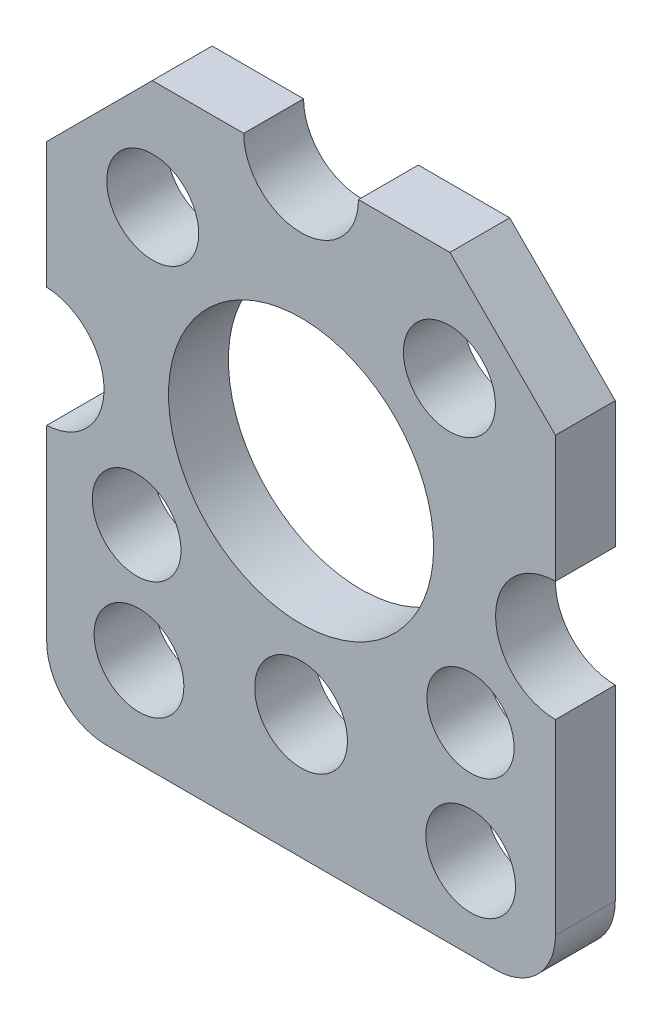
ISO-10303-21;
HEADER;
FILE_DESCRIPTION(('STEP AP214'),'2;1');
FILE_NAME('part.step','',(''),(''),'','','');
FILE_SCHEMA(('AUTOMOTIVE_DESIGN { 1 0 10303 214 1 1 1 1 }'));
ENDSEC;
DATA;
#1=APPLICATION_CONTEXT('core data for automotive mechanical design processes');
#2=APPLICATION_PROTOCOL_DEFINITION('international standard','automotive_design',2000,#1);
#3=PRODUCT_CONTEXT('',#1,'mechanical');
#4=PRODUCT('Part','Part','',(#3));
#5=PRODUCT_RELATED_PRODUCT_CATEGORY('part','',(#4));
#6=PRODUCT_DEFINITION_FORMATION('','',#4);
#7=PRODUCT_DEFINITION_CONTEXT('part definition',#1,'design');
#8=PRODUCT_DEFINITION('design','',#6,#7);
#9=PRODUCT_DEFINITION_SHAPE('','',#8);
#10=(LENGTH_UNIT() NAMED_UNIT(*) SI_UNIT(.MILLI.,.METRE.));
#11=(NAMED_UNIT(*) PLANE_ANGLE_UNIT() SI_UNIT($,.RADIAN.));
#12=(NAMED_UNIT(*) SI_UNIT($,.STERADIAN.) SOLID_ANGLE_UNIT());
#13=UNCERTAINTY_MEASURE_WITH_UNIT(LENGTH_MEASURE(1.E-05),#10,'distance_accuracy_value','');
#14=(GEOMETRIC_REPRESENTATION_CONTEXT(3) GLOBAL_UNCERTAINTY_ASSIGNED_CONTEXT((#13)) GLOBAL_UNIT_ASSIGNED_CONTEXT((#10,
#11,#12)) REPRESENTATION_CONTEXT('',''));
#15=CARTESIAN_POINT('',(0.,0.,0.));
#16=DIRECTION('',(0.,0.,1.));
#17=DIRECTION('',(1.,0.,0.));
#18=AXIS2_PLACEMENT_3D('',#15,#16,#17);
#19=CARTESIAN_POINT('',(-1.60380436077684,17.4149915302089,2.54));
#20=DIRECTION('',(1.,0.,0.));
#21=DIRECTION('',(0.,1.,0.));
#22=AXIS2_PLACEMENT_3D('',#19,#20,#21);
#23=PLANE('',#22);
#24=DIRECTION('',(0.,0.,1.));
#25=VECTOR('',#24,1.);
#26=CARTESIAN_POINT('',(-1.60380436077684,7.56433360169332,0.));
#27=LINE('',#26,#25);
#28=CARTESIAN_POINT('',(-1.60380436077684,7.56433360169332,0.));
#29=VERTEX_POINT('',#28);
#30=CARTESIAN_POINT('',(-1.60380436077684,7.56433360169332,2.54));
#31=VERTEX_POINT('',#30);
#32=EDGE_CURVE('E237',#29,#31,#27,.T.);
#33=ORIENTED_EDGE('',*,*,#32,.F.);
#34=DIRECTION('',(0.,-1.,0.));
#35=VECTOR('',#34,1.);
#36=CARTESIAN_POINT('',(-1.60380436077684,17.4149915302089,0.));
#37=LINE('',#36,#35);
#38=CARTESIAN_POINT('',(-1.60380436077684,12.9344399546406,0.));
#39=VERTEX_POINT('',#38);
#40=EDGE_CURVE('E172',#39,#29,#37,.T.);
#41=ORIENTED_EDGE('',*,*,#40,.F.);
#42=DIRECTION('',(0.,0.,-1.));
#43=VECTOR('',#42,1.);
#44=CARTESIAN_POINT('',(-1.60380436077684,12.9344399546405,2.54));
#45=LINE('',#44,#43);
#46=CARTESIAN_POINT('',(-1.60380436077684,12.9344399546405,2.54));
#47=VERTEX_POINT('',#46);
#48=EDGE_CURVE('E225',#47,#39,#45,.T.);
#49=ORIENTED_EDGE('',*,*,#48,.F.);
#50=DIRECTION('',(0.,-1.,0.));
#51=VECTOR('',#50,1.);
#52=CARTESIAN_POINT('',(-1.60380436077684,17.4149915302089,2.54));
#53=LINE('',#52,#51);
#54=EDGE_CURVE('E264',#47,#31,#53,.T.);
#55=ORIENTED_EDGE('',*,*,#54,.T.);
#56=EDGE_LOOP('',(#33,#41,#49,#55));
#57=FACE_BOUND('',#56,.T.);
#58=ADVANCED_FACE('F39',(#57),#23,.T.);
#59=CARTESIAN_POINT('',(-23.1938043607768,17.4149915302089,2.54));
#60=DIRECTION('',(0.,1.,0.));
#61=DIRECTION('',(0.,0.,1.));
#62=AXIS2_PLACEMENT_3D('',#59,#60,#61);
#63=PLANE('',#62);
#64=DIRECTION('',(0.,0.,1.));
#65=VECTOR('',#64,1.);
#66=CARTESIAN_POINT('',(-14.833145749413,17.4149915302089,0.));
#67=LINE('',#66,#65);
#68=CARTESIAN_POINT('',(-14.833145749413,17.4149915302089,0.));
#69=VERTEX_POINT('',#68);
#70=CARTESIAN_POINT('',(-14.833145749413,17.4149915302089,2.54));
#71=VERTEX_POINT('',#70);
#72=EDGE_CURVE('E141',#69,#71,#67,.T.);
#73=ORIENTED_EDGE('',*,*,#72,.F.);
#74=DIRECTION('',(1.,0.,0.));
#75=VECTOR('',#74,1.);
#76=CARTESIAN_POINT('',(-23.1938043607768,17.4149915302089,0.));
#77=LINE('',#76,#75);
#78=CARTESIAN_POINT('',(-18.7132527852085,17.4149915302089,0.));
#79=VERTEX_POINT('',#78);
#80=EDGE_CURVE('E155',#79,#69,#77,.T.);
#81=ORIENTED_EDGE('',*,*,#80,.F.);
#82=DIRECTION('',(0.,0.,-1.));
#83=VECTOR('',#82,1.);
#84=CARTESIAN_POINT('',(-18.7132527852085,17.4149915302089,2.54));
#85=LINE('',#84,#83);
#86=CARTESIAN_POINT('',(-18.7132527852085,17.4149915302089,2.54));
#87=VERTEX_POINT('',#86);
#88=EDGE_CURVE('E219',#87,#79,#85,.T.);
#89=ORIENTED_EDGE('',*,*,#88,.F.);
#90=DIRECTION('',(1.,0.,0.));
#91=VECTOR('',#90,1.);
#92=CARTESIAN_POINT('',(-23.1938043607768,17.4149915302089,2.54));
#93=LINE('',#92,#91);
#94=EDGE_CURVE('E157',#87,#71,#93,.T.);
#95=ORIENTED_EDGE('',*,*,#94,.T.);
#96=EDGE_LOOP('',(#73,#81,#89,#95));
#97=FACE_BOUND('',#96,.T.);
#98=ADVANCED_FACE('F153',(#97),#63,.T.);
#99=CARTESIAN_POINT('',(-23.1938043607768,17.4149915302089,2.54));
#100=DIRECTION('',(1.,0.,0.));
#101=DIRECTION('',(0.,1.,0.));
#102=AXIS2_PLACEMENT_3D('',#99,#100,#101);
#103=PLANE('',#102);
#104=DIRECTION('',(0.,-1.,0.));
#105=VECTOR('',#104,1.);
#106=CARTESIAN_POINT('',(-23.1938043607768,17.4149915302089,0.));
#107=LINE('',#106,#105);
#108=CARTESIAN_POINT('',(-23.1938043607768,12.9344399546405,0.));
#109=VERTEX_POINT('',#108);
#110=CARTESIAN_POINT('',(-23.1938043607768,7.57828265375295,0.));
#111=VERTEX_POINT('',#110);
#112=EDGE_CURVE('E170',#109,#111,#107,.T.);
#113=ORIENTED_EDGE('',*,*,#112,.T.);
#114=DIRECTION('',(0.,0.,1.));
#115=VECTOR('',#114,1.);
#116=CARTESIAN_POINT('',(-23.1938043607768,7.57828265375295,0.));
#117=LINE('',#116,#115);
#118=CARTESIAN_POINT('',(-23.1938043607768,7.57828265375295,2.54));
#119=VERTEX_POINT('',#118);
#120=EDGE_CURVE('E54',#111,#119,#117,.T.);
#121=ORIENTED_EDGE('',*,*,#120,.T.);
#122=DIRECTION('',(0.,-1.,0.));
#123=VECTOR('',#122,1.);
#124=CARTESIAN_POINT('',(-23.1938043607768,17.4149915302089,2.54));
#125=LINE('',#124,#123);
#126=CARTESIAN_POINT('',(-23.1938043607768,12.9344399546405,2.54));
#127=VERTEX_POINT('',#126);
#128=EDGE_CURVE('E184',#127,#119,#125,.T.);
#129=ORIENTED_EDGE('',*,*,#128,.F.);
#130=DIRECTION('',(0.,0.,-1.));
#131=VECTOR('',#130,1.);
#132=CARTESIAN_POINT('',(-23.1938043607768,12.9344399546405,2.54));
#133=LINE('',#132,#131);
#134=EDGE_CURVE('E217',#127,#109,#133,.T.);
#135=ORIENTED_EDGE('',*,*,#134,.T.);
#136=EDGE_LOOP('',(#113,#121,#129,#135));
#137=FACE_BOUND('',#136,.T.);
#138=ADVANCED_FACE('F222',(#137),#103,.F.);
#139=CARTESIAN_POINT('',(-23.1938043607768,-7.98500846979108,2.54));
#140=DIRECTION('',(0.,1.,0.));
#141=DIRECTION('',(0.,0.,1.));
#142=AXIS2_PLACEMENT_3D('',#139,#140,#141);
#143=PLANE('',#142);
#144=DIRECTION('',(1.,0.,0.));
#145=VECTOR('',#144,1.);
#146=CARTESIAN_POINT('',(-23.1938043607768,-7.98500846979108,0.));
#147=LINE('',#146,#145);
#148=CARTESIAN_POINT('',(-20.6538043607768,-7.98500846979108,0.));
#149=VERTEX_POINT('',#148);
#150=CARTESIAN_POINT('',(-4.14380436077684,-7.98500846979108,0.));
#151=VERTEX_POINT('',#150);
#152=EDGE_CURVE('E259',#149,#151,#147,.T.);
#153=ORIENTED_EDGE('',*,*,#152,.T.);
#154=DIRECTION('',(0.,0.,-1.));
#155=VECTOR('',#154,1.);
#156=CARTESIAN_POINT('',(-4.14380436077684,-7.98500846979108,2.54));
#157=LINE('',#156,#155);
#158=CARTESIAN_POINT('',(-4.14380436077684,-7.98500846979108,2.54));
#159=VERTEX_POINT('',#158);
#160=EDGE_CURVE('E195',#151,#159,#157,.F.);
#161=ORIENTED_EDGE('',*,*,#160,.T.);
#162=DIRECTION('',(1.,0.,0.));
#163=VECTOR('',#162,1.);
#164=CARTESIAN_POINT('',(-23.1938043607768,-7.98500846979108,2.54));
#165=LINE('',#164,#163);
#166=CARTESIAN_POINT('',(-20.6538043607768,-7.98500846979108,2.54));
#167=VERTEX_POINT('',#166);
#168=EDGE_CURVE('E178',#167,#159,#165,.T.);
#169=ORIENTED_EDGE('',*,*,#168,.F.);
#170=DIRECTION('',(0.,0.,-1.));
#171=VECTOR('',#170,1.);
#172=CARTESIAN_POINT('',(-20.6538043607768,-7.98500846979108,2.54));
#173=LINE('',#172,#171);
#174=EDGE_CURVE('E191',#167,#149,#173,.T.);
#175=ORIENTED_EDGE('',*,*,#174,.T.);
#176=EDGE_LOOP('',(#153,#161,#169,#175));
#177=FACE_BOUND('',#176,.T.);
#178=ADVANCED_FACE('F428',(#177),#143,.F.);
#179=DIRECTION('',(0.,0.,1.));
#180=VECTOR('',#179,1.);
#181=CARTESIAN_POINT('',(-1.60380436077684,2.48342628813906,0.));
#182=LINE('',#181,#180);
#183=CARTESIAN_POINT('',(-1.60380436077684,2.48342628813906,2.54));
#184=VERTEX_POINT('',#183);
#185=CARTESIAN_POINT('',(-1.60380436077684,2.48342628813906,0.));
#186=VERTEX_POINT('',#185);
#187=EDGE_CURVE('E62',#184,#186,#182,.F.);
#188=ORIENTED_EDGE('',*,*,#187,.F.);
#189=CARTESIAN_POINT('',(-1.60380436077684,-5.44500846979108,2.54));
#190=VERTEX_POINT('',#189);
#191=EDGE_CURVE('E263',#184,#190,#53,.T.);
#192=ORIENTED_EDGE('',*,*,#191,.T.);
#193=DIRECTION('',(0.,0.,-1.));
#194=VECTOR('',#193,1.);
#195=CARTESIAN_POINT('',(-1.60380436077684,-5.44500846979108,0.));
#196=LINE('',#195,#194);
#197=CARTESIAN_POINT('',(-1.60380436077684,-5.44500846979108,0.));
#198=VERTEX_POINT('',#197);
#199=EDGE_CURVE('E179',#190,#198,#196,.T.);
#200=ORIENTED_EDGE('',*,*,#199,.T.);
#201=EDGE_CURVE('E274',#186,#198,#37,.T.);
#202=ORIENTED_EDGE('',*,*,#201,.F.);
#203=EDGE_LOOP('',(#188,#192,#200,#202));
#204=FACE_BOUND('',#203,.T.);
#205=ADVANCED_FACE('F420',(#204),#23,.T.);
#206=DIRECTION('',(0.,0.,1.));
#207=VECTOR('',#206,1.);
#208=CARTESIAN_POINT('',(-9.96446297214064,17.4149915302089,0.));
#209=LINE('',#208,#207);
#210=CARTESIAN_POINT('',(-9.96446297214064,17.4149915302089,2.54));
#211=VERTEX_POINT('',#210);
#212=CARTESIAN_POINT('',(-9.96446297214064,17.4149915302089,0.));
#213=VERTEX_POINT('',#212);
#214=EDGE_CURVE('E144',#211,#213,#209,.F.);
#215=ORIENTED_EDGE('',*,*,#214,.F.);
#216=CARTESIAN_POINT('',(-6.08435593634521,17.4149915302089,2.54));
#217=VERTEX_POINT('',#216);
#218=EDGE_CURVE('E268',#211,#217,#93,.T.);
#219=ORIENTED_EDGE('',*,*,#218,.T.);
#220=DIRECTION('',(0.,0.,1.));
#221=VECTOR('',#220,1.);
#222=CARTESIAN_POINT('',(-6.08435593634521,17.4149915302089,2.54));
#223=LINE('',#222,#221);
#224=CARTESIAN_POINT('',(-6.08435593634521,17.4149915302089,0.));
#225=VERTEX_POINT('',#224);
#226=EDGE_CURVE('E249',#225,#217,#223,.T.);
#227=ORIENTED_EDGE('',*,*,#226,.F.);
#228=EDGE_CURVE('E166',#213,#225,#77,.T.);
#229=ORIENTED_EDGE('',*,*,#228,.F.);
#230=EDGE_LOOP('',(#215,#219,#227,#229));
#231=FACE_BOUND('',#230,.T.);
#232=ADVANCED_FACE('F425',(#231),#63,.T.);
#233=CARTESIAN_POINT('',(-23.1938043607768,2.50287057820995,2.54));
#234=VERTEX_POINT('',#233);
#235=CARTESIAN_POINT('',(-23.1938043607768,-5.44500846979108,2.54));
#236=VERTEX_POINT('',#235);
#237=EDGE_CURVE('E235',#234,#236,#125,.T.);
#238=ORIENTED_EDGE('',*,*,#237,.F.);
#239=DIRECTION('',(0.,0.,1.));
#240=VECTOR('',#239,1.);
#241=CARTESIAN_POINT('',(-23.1938043607768,2.50287057820995,0.));
#242=LINE('',#241,#240);
#243=CARTESIAN_POINT('',(-23.1938043607768,2.50287057820995,0.));
#244=VERTEX_POINT('',#243);
#245=EDGE_CURVE('E230',#234,#244,#242,.F.);
#246=ORIENTED_EDGE('',*,*,#245,.T.);
#247=CARTESIAN_POINT('',(-23.1938043607768,-5.44500846979108,0.));
#248=VERTEX_POINT('',#247);
#249=EDGE_CURVE('E165',#244,#248,#107,.T.);
#250=ORIENTED_EDGE('',*,*,#249,.T.);
#251=DIRECTION('',(0.,0.,-1.));
#252=VECTOR('',#251,1.);
#253=CARTESIAN_POINT('',(-23.1938043607768,-5.44500846979108,2.54));
#254=LINE('',#253,#252);
#255=EDGE_CURVE('E205',#248,#236,#254,.F.);
#256=ORIENTED_EDGE('',*,*,#255,.T.);
#257=EDGE_LOOP('',(#238,#246,#250,#256));
#258=FACE_BOUND('',#257,.T.);
#259=ADVANCED_FACE('F234',(#258),#103,.F.);
#260=CARTESIAN_POINT('',(0.,0.,2.54));
#261=DIRECTION('',(0.,0.,-1.));
#262=DIRECTION('',(-1.,0.,0.));
#263=AXIS2_PLACEMENT_3D('',#260,#261,#262);
#264=PLANE('',#263);
#265=CARTESIAN_POINT('',(-5.20901797622386,0.565757183283999,2.54));
#266=DIRECTION('',(0.,0.,1.));
#267=DIRECTION('',(1.,0.,0.));
#268=AXIS2_PLACEMENT_3D('',#265,#266,#267);
#269=CIRCLE('',#268,1.8514873226642);
#270=CARTESIAN_POINT('',(-3.35753065355966,0.565757183283999,2.54));
#271=VERTEX_POINT('',#270);
#272=EDGE_CURVE('E368',#271,#271,#269,.T.);
#273=ORIENTED_EDGE('',*,*,#272,.F.);
#274=EDGE_LOOP('',(#273));
#275=FACE_BOUND('',#274,.T.);
#276=CARTESIAN_POINT('',(-19.3770504071242,0.756131760276446,2.54));
#277=DIRECTION('',(0.,0.,1.));
#278=DIRECTION('',(1.,0.,0.));
#279=AXIS2_PLACEMENT_3D('',#276,#277,#278);
#280=CIRCLE('',#279,1.88295411513424);
#281=CARTESIAN_POINT('',(-17.49409629199,0.756131760276446,2.54));
#282=VERTEX_POINT('',#281);
#283=EDGE_CURVE('E364',#282,#282,#280,.T.);
#284=ORIENTED_EDGE('',*,*,#283,.F.);
#285=EDGE_LOOP('',(#284));
#286=FACE_BOUND('',#285,.T.);
#287=CARTESIAN_POINT('',(-18.693449352379,12.7711353191957,2.54));
#288=DIRECTION('',(0.,0.,1.));
#289=DIRECTION('',(1.,0.,0.));
#290=AXIS2_PLACEMENT_3D('',#287,#288,#289);
#291=CIRCLE('',#290,1.9512973087732);
#292=CARTESIAN_POINT('',(-16.7421520436057,12.7711353191957,2.54));
#293=VERTEX_POINT('',#292);
#294=EDGE_CURVE('E305',#293,#293,#291,.T.);
#295=ORIENTED_EDGE('',*,*,#294,.F.);
#296=EDGE_LOOP('',(#295));
#297=FACE_BOUND('',#296,.T.);
#298=CARTESIAN_POINT('',(-5.20253913165082,-4.50864534660245,2.54));
#299=DIRECTION('',(0.,0.,1.));
#300=DIRECTION('',(1.,0.,0.));
#301=AXIS2_PLACEMENT_3D('',#298,#299,#300);
#302=CIRCLE('',#301,1.905);
#303=CARTESIAN_POINT('',(-3.29753913165082,-4.50864534660245,2.54));
#304=VERTEX_POINT('',#303);
#305=EDGE_CURVE('E344',#304,#304,#302,.T.);
#306=ORIENTED_EDGE('',*,*,#305,.F.);
#307=EDGE_LOOP('',(#306));
#308=FACE_BOUND('',#307,.T.);
#309=CARTESIAN_POINT('',(-19.277832839663,-4.1747119252973,2.54));
#310=DIRECTION('',(0.,0.,1.));
#311=DIRECTION('',(1.,0.,0.));
#312=AXIS2_PLACEMENT_3D('',#309,#310,#311);
#313=CIRCLE('',#312,1.905);
#314=CARTESIAN_POINT('',(-17.372832839663,-4.1747119252973,2.54));
#315=VERTEX_POINT('',#314);
#316=EDGE_CURVE('E353',#315,#315,#313,.T.);
#317=ORIENTED_EDGE('',*,*,#316,.F.);
#318=EDGE_LOOP('',(#317));
#319=FACE_BOUND('',#318,.T.);
#320=CARTESIAN_POINT('',(-12.3988043607768,-2.72337542936332,2.54));
#321=DIRECTION('',(0.,0.,1.));
#322=DIRECTION('',(1.,0.,0.));
#323=AXIS2_PLACEMENT_3D('',#320,#321,#322);
#324=CIRCLE('',#323,1.96893329895696);
#325=CARTESIAN_POINT('',(-10.4298710618199,-2.72337542936332,2.54));
#326=VERTEX_POINT('',#325);
#327=EDGE_CURVE('E328',#326,#326,#324,.T.);
#328=ORIENTED_EDGE('',*,*,#327,.F.);
#329=EDGE_LOOP('',(#328));
#330=FACE_BOUND('',#329,.T.);
#331=CARTESIAN_POINT('',(-6.10415936917472,12.7711353191957,2.54));
#332=DIRECTION('',(0.,0.,1.));
#333=DIRECTION('',(-1.,0.,0.));
#334=AXIS2_PLACEMENT_3D('',#331,#332,#333);
#335=CIRCLE('',#334,1.9512973087732);
#336=CARTESIAN_POINT('',(-8.05545667794793,12.7711353191957,2.54));
#337=VERTEX_POINT('',#336);
#338=EDGE_CURVE('E337',#337,#337,#335,.T.);
#339=ORIENTED_EDGE('',*,*,#338,.F.);
#340=EDGE_LOOP('',(#339));
#341=FACE_BOUND('',#340,.T.);
#342=CARTESIAN_POINT('',(-12.3988043607768,6.22604026161474,2.54));
#343=DIRECTION('',(0.,0.,1.));
#344=DIRECTION('',(1.,0.,0.));
#345=AXIS2_PLACEMENT_3D('',#342,#343,#344);
#346=CIRCLE('',#345,5.62548983103598);
#347=CARTESIAN_POINT('',(-6.77331452974086,6.22604026161474,2.54));
#348=VERTEX_POINT('',#347);
#349=EDGE_CURVE('E320',#348,#348,#346,.T.);
#350=ORIENTED_EDGE('',*,*,#349,.F.);
#351=EDGE_LOOP('',(#350));
#352=FACE_BOUND('',#351,.T.);
#353=ORIENTED_EDGE('',*,*,#128,.T.);
#354=CARTESIAN_POINT('',(-23.30173056639,5.04057661598145,2.54));
#355=DIRECTION('',(0.,0.,1.));
#356=DIRECTION('',(1.,0.,0.));
#357=AXIS2_PLACEMENT_3D('',#354,#355,#356);
#358=CIRCLE('',#357,2.54);
#359=EDGE_CURVE('E302',#234,#119,#358,.T.);
#360=ORIENTED_EDGE('',*,*,#359,.F.);
#361=ORIENTED_EDGE('',*,*,#237,.T.);
#362=CARTESIAN_POINT('',(-20.6538043607768,-5.44500846979108,2.54));
#363=DIRECTION('',(0.,0.,-1.));
#364=DIRECTION('',(-1.,0.,0.));
#365=AXIS2_PLACEMENT_3D('',#362,#363,#364);
#366=CIRCLE('',#365,2.54);
#367=EDGE_CURVE('E198',#236,#167,#366,.F.);
#368=ORIENTED_EDGE('',*,*,#367,.T.);
#369=ORIENTED_EDGE('',*,*,#168,.T.);
#370=CARTESIAN_POINT('',(-4.14380436077684,-5.44500846979108,2.54));
#371=DIRECTION('',(0.,0.,-1.));
#372=DIRECTION('',(-1.,0.,0.));
#373=AXIS2_PLACEMENT_3D('',#370,#371,#372);
#374=CIRCLE('',#373,2.54);
#375=EDGE_CURVE('E201',#159,#190,#374,.F.);
#376=ORIENTED_EDGE('',*,*,#375,.T.);
#377=ORIENTED_EDGE('',*,*,#191,.F.);
#378=CARTESIAN_POINT('',(-1.60380436077684,5.02387994491619,2.54));
#379=DIRECTION('',(0.,0.,1.));
#380=DIRECTION('',(1.,0.,0.));
#381=AXIS2_PLACEMENT_3D('',#378,#379,#380);
#382=CIRCLE('',#381,2.54045365677713);
#383=EDGE_CURVE('E292',#31,#184,#382,.T.);
#384=ORIENTED_EDGE('',*,*,#383,.F.);
#385=ORIENTED_EDGE('',*,*,#54,.F.);
#386=DIRECTION('',(0.707106781186548,-0.707106781186547,0.));
#387=VECTOR('',#386,1.);
#388=CARTESIAN_POINT('',(-0.530444135305015,11.8610797291687,2.54));
#389=LINE('',#388,#387);
#390=EDGE_CURVE('E241',#217,#47,#389,.T.);
#391=ORIENTED_EDGE('',*,*,#390,.F.);
#392=ORIENTED_EDGE('',*,*,#218,.F.);
#393=CARTESIAN_POINT('',(-12.3988043607768,17.4149915302089,2.54));
#394=DIRECTION('',(0.,0.,1.));
#395=DIRECTION('',(1.,0.,0.));
#396=AXIS2_PLACEMENT_3D('',#393,#394,#395);
#397=CIRCLE('',#396,2.4343413886362);
#398=EDGE_CURVE('E312',#71,#211,#397,.T.);
#399=ORIENTED_EDGE('',*,*,#398,.F.);
#400=ORIENTED_EDGE('',*,*,#94,.F.);
#401=DIRECTION('',(0.707106781186548,0.707106781186548,0.));
#402=VECTOR('',#401,1.);
#403=CARTESIAN_POINT('',(-24.2671645862487,11.8610797291687,2.54));
#404=LINE('',#403,#402);
#405=EDGE_CURVE('E246',#127,#87,#404,.T.);
#406=ORIENTED_EDGE('',*,*,#405,.F.);
#407=EDGE_LOOP('',(#353,#360,#361,#368,#369,#376,#377,#384,#385,#391,#392,#399,#400,#406));
#408=FACE_BOUND('',#407,.T.);
#409=ADVANCED_FACE('F295',(#275,#286,#297,#308,#319,#330,#341,#352,#408),#264,.F.);
#410=CARTESIAN_POINT('',(0.,0.,0.));
#411=DIRECTION('',(0.,0.,-1.));
#412=DIRECTION('',(-1.,0.,0.));
#413=AXIS2_PLACEMENT_3D('',#410,#411,#412);
#414=PLANE('',#413);
#415=CARTESIAN_POINT('',(-5.20901797622386,0.565757183283999,0.));
#416=DIRECTION('',(0.,0.,1.));
#417=DIRECTION('',(1.,0.,0.));
#418=AXIS2_PLACEMENT_3D('',#415,#416,#417);
#419=CIRCLE('',#418,1.8514873226642);
#420=CARTESIAN_POINT('',(-3.35753065355966,0.565757183283999,0.));
#421=VERTEX_POINT('',#420);
#422=EDGE_CURVE('E349',#421,#421,#419,.T.);
#423=ORIENTED_EDGE('',*,*,#422,.T.);
#424=EDGE_LOOP('',(#423));
#425=FACE_BOUND('',#424,.T.);
#426=CARTESIAN_POINT('',(-19.3770504071242,0.756131760276446,0.));
#427=DIRECTION('',(0.,0.,1.));
#428=DIRECTION('',(1.,0.,0.));
#429=AXIS2_PLACEMENT_3D('',#426,#427,#428);
#430=CIRCLE('',#429,1.88295411513424);
#431=CARTESIAN_POINT('',(-17.49409629199,0.756131760276446,0.));
#432=VERTEX_POINT('',#431);
#433=EDGE_CURVE('E360',#432,#432,#430,.T.);
#434=ORIENTED_EDGE('',*,*,#433,.T.);
#435=EDGE_LOOP('',(#434));
#436=FACE_BOUND('',#435,.T.);
#437=CARTESIAN_POINT('',(-23.30173056639,5.04057661598145,0.));
#438=DIRECTION('',(0.,0.,-1.));
#439=DIRECTION('',(-1.,0.,0.));
#440=AXIS2_PLACEMENT_3D('',#437,#438,#439);
#441=CIRCLE('',#440,2.54);
#442=EDGE_CURVE('E11',#111,#244,#441,.T.);
#443=ORIENTED_EDGE('',*,*,#442,.F.);
#444=ORIENTED_EDGE('',*,*,#112,.F.);
#445=DIRECTION('',(-0.707106781186548,-0.707106781186548,0.));
#446=VECTOR('',#445,1.);
#447=CARTESIAN_POINT('',(-18.0641221577087,18.0641221577087,0.));
#448=LINE('',#447,#446);
#449=EDGE_CURVE('E149',#79,#109,#448,.T.);
#450=ORIENTED_EDGE('',*,*,#449,.F.);
#451=ORIENTED_EDGE('',*,*,#80,.T.);
#452=CARTESIAN_POINT('',(-12.3988043607768,17.4149915302089,0.));
#453=DIRECTION('',(0.,0.,-1.));
#454=DIRECTION('',(-1.,0.,0.));
#455=AXIS2_PLACEMENT_3D('',#452,#453,#454);
#456=CIRCLE('',#455,2.4343413886362);
#457=EDGE_CURVE('E48',#213,#69,#456,.T.);
#458=ORIENTED_EDGE('',*,*,#457,.F.);
#459=ORIENTED_EDGE('',*,*,#228,.T.);
#460=DIRECTION('',(-0.707106781186548,0.707106781186547,0.));
#461=VECTOR('',#460,1.);
#462=CARTESIAN_POINT('',(5.66531779693186,5.66531779693186,0.));
#463=LINE('',#462,#461);
#464=EDGE_CURVE('E209',#39,#225,#463,.T.);
#465=ORIENTED_EDGE('',*,*,#464,.F.);
#466=ORIENTED_EDGE('',*,*,#40,.T.);
#467=CARTESIAN_POINT('',(-1.60380436077684,5.02387994491619,0.));
#468=DIRECTION('',(0.,0.,1.));
#469=DIRECTION('',(1.,0.,0.));
#470=AXIS2_PLACEMENT_3D('',#467,#468,#469);
#471=CIRCLE('',#470,2.54045365677713);
#472=EDGE_CURVE('E285',#29,#186,#471,.T.);
#473=ORIENTED_EDGE('',*,*,#472,.T.);
#474=ORIENTED_EDGE('',*,*,#201,.T.);
#475=CARTESIAN_POINT('',(-4.14380436077684,-5.44500846979108,0.));
#476=DIRECTION('',(0.,0.,-1.));
#477=DIRECTION('',(-1.,0.,0.));
#478=AXIS2_PLACEMENT_3D('',#475,#476,#477);
#479=CIRCLE('',#478,2.54);
#480=EDGE_CURVE('E188',#198,#151,#479,.T.);
#481=ORIENTED_EDGE('',*,*,#480,.T.);
#482=ORIENTED_EDGE('',*,*,#152,.F.);
#483=CARTESIAN_POINT('',(-20.6538043607768,-5.44500846979108,0.));
#484=DIRECTION('',(0.,0.,-1.));
#485=DIRECTION('',(-1.,0.,0.));
#486=AXIS2_PLACEMENT_3D('',#483,#484,#485);
#487=CIRCLE('',#486,2.54);
#488=EDGE_CURVE('E183',#149,#248,#487,.T.);
#489=ORIENTED_EDGE('',*,*,#488,.T.);
#490=ORIENTED_EDGE('',*,*,#249,.F.);
#491=EDGE_LOOP('',(#443,#444,#450,#451,#458,#459,#465,#466,#473,#474,#481,#482,#489,#490));
#492=FACE_BOUND('',#491,.T.);
#493=CARTESIAN_POINT('',(-18.693449352379,12.7711353191957,0.));
#494=DIRECTION('',(0.,0.,1.));
#495=DIRECTION('',(1.,0.,0.));
#496=AXIS2_PLACEMENT_3D('',#493,#494,#495);
#497=CIRCLE('',#496,1.9512973087732);
#498=CARTESIAN_POINT('',(-16.7421520436057,12.7711353191957,0.));
#499=VERTEX_POINT('',#498);
#500=EDGE_CURVE('E298',#499,#499,#497,.T.);
#501=ORIENTED_EDGE('',*,*,#500,.T.);
#502=EDGE_LOOP('',(#501));
#503=FACE_BOUND('',#502,.T.);
#504=CARTESIAN_POINT('',(-5.20253913165082,-4.50864534660245,0.));
#505=DIRECTION('',(0.,0.,1.));
#506=DIRECTION('',(1.,0.,0.));
#507=AXIS2_PLACEMENT_3D('',#504,#505,#506);
#508=CIRCLE('',#507,1.905);
#509=CARTESIAN_POINT('',(-3.29753913165082,-4.50864534660245,0.));
#510=VERTEX_POINT('',#509);
#511=EDGE_CURVE('E348',#510,#510,#508,.T.);
#512=ORIENTED_EDGE('',*,*,#511,.T.);
#513=EDGE_LOOP('',(#512));
#514=FACE_BOUND('',#513,.T.);
#515=CARTESIAN_POINT('',(-19.277832839663,-4.1747119252973,0.));
#516=DIRECTION('',(0.,0.,1.));
#517=DIRECTION('',(1.,0.,0.));
#518=AXIS2_PLACEMENT_3D('',#515,#516,#517);
#519=CIRCLE('',#518,1.905);
#520=CARTESIAN_POINT('',(-17.372832839663,-4.1747119252973,0.));
#521=VERTEX_POINT('',#520);
#522=EDGE_CURVE('E333',#521,#521,#519,.T.);
#523=ORIENTED_EDGE('',*,*,#522,.T.);
#524=EDGE_LOOP('',(#523));
#525=FACE_BOUND('',#524,.T.);
#526=CARTESIAN_POINT('',(-12.3988043607768,-2.72337542936332,0.));
#527=DIRECTION('',(0.,0.,1.));
#528=DIRECTION('',(1.,0.,0.));
#529=AXIS2_PLACEMENT_3D('',#526,#527,#528);
#530=CIRCLE('',#529,1.96893329895696);
#531=CARTESIAN_POINT('',(-10.4298710618199,-2.72337542936332,0.));
#532=VERTEX_POINT('',#531);
#533=EDGE_CURVE('E332',#532,#532,#530,.T.);
#534=ORIENTED_EDGE('',*,*,#533,.T.);
#535=EDGE_LOOP('',(#534));
#536=FACE_BOUND('',#535,.T.);
#537=CARTESIAN_POINT('',(-6.10415936917472,12.7711353191957,0.));
#538=DIRECTION('',(0.,0.,1.));
#539=DIRECTION('',(-1.,0.,0.));
#540=AXIS2_PLACEMENT_3D('',#537,#538,#539);
#541=CIRCLE('',#540,1.9512973087732);
#542=CARTESIAN_POINT('',(-8.05545667794793,12.7711353191957,0.));
#543=VERTEX_POINT('',#542);
#544=EDGE_CURVE('E315',#543,#543,#541,.T.);
#545=ORIENTED_EDGE('',*,*,#544,.T.);
#546=EDGE_LOOP('',(#545));
#547=FACE_BOUND('',#546,.T.);
#548=CARTESIAN_POINT('',(-12.3988043607768,6.22604026161474,0.));
#549=DIRECTION('',(0.,0.,1.));
#550=DIRECTION('',(1.,0.,0.));
#551=AXIS2_PLACEMENT_3D('',#548,#549,#550);
#552=CIRCLE('',#551,5.62548983103598);
#553=CARTESIAN_POINT('',(-6.77331452974086,6.22604026161474,0.));
#554=VERTEX_POINT('',#553);
#555=EDGE_CURVE('E316',#554,#554,#552,.T.);
#556=ORIENTED_EDGE('',*,*,#555,.T.);
#557=EDGE_LOOP('',(#556));
#558=FACE_BOUND('',#557,.T.);
#559=ADVANCED_FACE('F161',(#425,#436,#492,#503,#514,#525,#536,#547,#558),#414,.T.);
#560=CARTESIAN_POINT('',(-4.14380436077684,-5.44500846979108,2.54));
#561=DIRECTION('',(0.,0.,1.));
#562=DIRECTION('',(1.,0.,0.));
#563=AXIS2_PLACEMENT_3D('',#560,#561,#562);
#564=CYLINDRICAL_SURFACE('',#563,2.54);
#565=ORIENTED_EDGE('',*,*,#375,.F.);
#566=ORIENTED_EDGE('',*,*,#160,.F.);
#567=ORIENTED_EDGE('',*,*,#480,.F.);
#568=ORIENTED_EDGE('',*,*,#199,.F.);
#569=EDGE_LOOP('',(#565,#566,#567,#568));
#570=FACE_BOUND('',#569,.T.);
#571=ADVANCED_FACE('F438',(#570),#564,.T.);
#572=CARTESIAN_POINT('',(-20.6538043607768,-5.44500846979108,2.54));
#573=DIRECTION('',(0.,0.,-1.));
#574=DIRECTION('',(-1.,0.,0.));
#575=AXIS2_PLACEMENT_3D('',#572,#573,#574);
#576=CYLINDRICAL_SURFACE('',#575,2.54);
#577=ORIENTED_EDGE('',*,*,#367,.F.);
#578=ORIENTED_EDGE('',*,*,#255,.F.);
#579=ORIENTED_EDGE('',*,*,#488,.F.);
#580=ORIENTED_EDGE('',*,*,#174,.F.);
#581=EDGE_LOOP('',(#577,#578,#579,#580));
#582=FACE_BOUND('',#581,.T.);
#583=ADVANCED_FACE('F41',(#582),#576,.T.);
#584=CARTESIAN_POINT('',(-0.530444135305015,11.8610797291687,0.));
#585=DIRECTION('',(-0.707106781186547,-0.707106781186548,0.));
#586=DIRECTION('',(0.707106781186548,-0.707106781186547,0.));
#587=AXIS2_PLACEMENT_3D('',#584,#585,#586);
#588=PLANE('',#587);
#589=ORIENTED_EDGE('',*,*,#48,.T.);
#590=ORIENTED_EDGE('',*,*,#464,.T.);
#591=ORIENTED_EDGE('',*,*,#226,.T.);
#592=ORIENTED_EDGE('',*,*,#390,.T.);
#593=EDGE_LOOP('',(#589,#590,#591,#592));
#594=FACE_BOUND('',#593,.T.);
#595=ADVANCED_FACE('F414',(#594),#588,.F.);
#596=CARTESIAN_POINT('',(-24.2671645862487,11.8610797291687,0.));
#597=DIRECTION('',(0.707106781186548,-0.707106781186548,0.));
#598=DIRECTION('',(0.707106781186548,0.707106781186548,0.));
#599=AXIS2_PLACEMENT_3D('',#596,#597,#598);
#600=PLANE('',#599);
#601=ORIENTED_EDGE('',*,*,#88,.T.);
#602=ORIENTED_EDGE('',*,*,#449,.T.);
#603=ORIENTED_EDGE('',*,*,#134,.F.);
#604=ORIENTED_EDGE('',*,*,#405,.T.);
#605=EDGE_LOOP('',(#601,#602,#603,#604));
#606=FACE_BOUND('',#605,.T.);
#607=ADVANCED_FACE('F216',(#606),#600,.F.);
#608=CARTESIAN_POINT('',(-12.3988043607768,6.22604026161474,0.));
#609=DIRECTION('',(0.,0.,1.));
#610=DIRECTION('',(1.,0.,0.));
#611=AXIS2_PLACEMENT_3D('',#608,#609,#610);
#612=CYLINDRICAL_SURFACE('',#611,5.62548983103598);
#613=ORIENTED_EDGE('',*,*,#555,.F.);
#614=EDGE_LOOP('',(#613));
#615=FACE_BOUND('',#614,.T.);
#616=ORIENTED_EDGE('',*,*,#349,.T.);
#617=EDGE_LOOP('',(#616));
#618=FACE_BOUND('',#617,.T.);
#619=ADVANCED_FACE('F402',(#615,#618),#612,.F.);
#620=CARTESIAN_POINT('',(-6.10415936917472,12.7711353191957,0.));
#621=DIRECTION('',(0.,0.,1.));
#622=DIRECTION('',(1.,0.,0.));
#623=AXIS2_PLACEMENT_3D('',#620,#621,#622);
#624=CYLINDRICAL_SURFACE('',#623,1.9512973087732);
#625=ORIENTED_EDGE('',*,*,#544,.F.);
#626=EDGE_LOOP('',(#625));
#627=FACE_BOUND('',#626,.T.);
#628=ORIENTED_EDGE('',*,*,#338,.T.);
#629=EDGE_LOOP('',(#628));
#630=FACE_BOUND('',#629,.T.);
#631=ADVANCED_FACE('F404',(#627,#630),#624,.F.);
#632=CARTESIAN_POINT('',(-12.3988043607768,-2.72337542936332,0.));
#633=DIRECTION('',(0.,0.,1.));
#634=DIRECTION('',(1.,0.,0.));
#635=AXIS2_PLACEMENT_3D('',#632,#633,#634);
#636=CYLINDRICAL_SURFACE('',#635,1.96893329895696);
#637=ORIENTED_EDGE('',*,*,#533,.F.);
#638=EDGE_LOOP('',(#637));
#639=FACE_BOUND('',#638,.T.);
#640=ORIENTED_EDGE('',*,*,#327,.T.);
#641=EDGE_LOOP('',(#640));
#642=FACE_BOUND('',#641,.T.);
#643=ADVANCED_FACE('F411',(#639,#642),#636,.F.);
#644=CARTESIAN_POINT('',(-19.277832839663,-4.1747119252973,0.));
#645=DIRECTION('',(0.,0.,1.));
#646=DIRECTION('',(1.,0.,0.));
#647=AXIS2_PLACEMENT_3D('',#644,#645,#646);
#648=CYLINDRICAL_SURFACE('',#647,1.905);
#649=ORIENTED_EDGE('',*,*,#522,.F.);
#650=EDGE_LOOP('',(#649));
#651=FACE_BOUND('',#650,.T.);
#652=ORIENTED_EDGE('',*,*,#316,.T.);
#653=EDGE_LOOP('',(#652));
#654=FACE_BOUND('',#653,.T.);
#655=ADVANCED_FACE('F524',(#651,#654),#648,.F.);
#656=CARTESIAN_POINT('',(-5.20253913165082,-4.50864534660245,0.));
#657=DIRECTION('',(0.,0.,1.));
#658=DIRECTION('',(1.,0.,0.));
#659=AXIS2_PLACEMENT_3D('',#656,#657,#658);
#660=CYLINDRICAL_SURFACE('',#659,1.905);
#661=ORIENTED_EDGE('',*,*,#511,.F.);
#662=EDGE_LOOP('',(#661));
#663=FACE_BOUND('',#662,.T.);
#664=ORIENTED_EDGE('',*,*,#305,.T.);
#665=EDGE_LOOP('',(#664));
#666=FACE_BOUND('',#665,.T.);
#667=ADVANCED_FACE('F533',(#663,#666),#660,.F.);
#668=CARTESIAN_POINT('',(-12.3988043607768,17.4149915302089,0.));
#669=DIRECTION('',(0.,0.,1.));
#670=DIRECTION('',(1.,0.,0.));
#671=AXIS2_PLACEMENT_3D('',#668,#669,#670);
#672=CYLINDRICAL_SURFACE('',#671,2.4343413886362);
#673=ORIENTED_EDGE('',*,*,#72,.T.);
#674=ORIENTED_EDGE('',*,*,#398,.T.);
#675=ORIENTED_EDGE('',*,*,#214,.T.);
#676=ORIENTED_EDGE('',*,*,#457,.T.);
#677=EDGE_LOOP('',(#673,#674,#675,#676));
#678=FACE_BOUND('',#677,.T.);
#679=ADVANCED_FACE('F140',(#678),#672,.F.);
#680=CARTESIAN_POINT('',(-18.693449352379,12.7711353191957,0.));
#681=DIRECTION('',(0.,0.,1.));
#682=DIRECTION('',(1.,0.,0.));
#683=AXIS2_PLACEMENT_3D('',#680,#681,#682);
#684=CYLINDRICAL_SURFACE('',#683,1.9512973087732);
#685=ORIENTED_EDGE('',*,*,#500,.F.);
#686=EDGE_LOOP('',(#685));
#687=FACE_BOUND('',#686,.T.);
#688=ORIENTED_EDGE('',*,*,#294,.T.);
#689=EDGE_LOOP('',(#688));
#690=FACE_BOUND('',#689,.T.);
#691=ADVANCED_FACE('F550',(#687,#690),#684,.F.);
#692=CARTESIAN_POINT('',(-1.60380436077684,5.02387994491619,0.));
#693=DIRECTION('',(0.,0.,1.));
#694=DIRECTION('',(1.,0.,0.));
#695=AXIS2_PLACEMENT_3D('',#692,#693,#694);
#696=CYLINDRICAL_SURFACE('',#695,2.54045365677713);
#697=ORIENTED_EDGE('',*,*,#32,.T.);
#698=ORIENTED_EDGE('',*,*,#383,.T.);
#699=ORIENTED_EDGE('',*,*,#187,.T.);
#700=ORIENTED_EDGE('',*,*,#472,.F.);
#701=EDGE_LOOP('',(#697,#698,#699,#700));
#702=FACE_BOUND('',#701,.T.);
#703=ADVANCED_FACE('F291',(#702),#696,.F.);
#704=CARTESIAN_POINT('',(-23.30173056639,5.04057661598145,0.));
#705=DIRECTION('',(0.,0.,1.));
#706=DIRECTION('',(1.,0.,0.));
#707=AXIS2_PLACEMENT_3D('',#704,#705,#706);
#708=CYLINDRICAL_SURFACE('',#707,2.54);
#709=ORIENTED_EDGE('',*,*,#442,.T.);
#710=ORIENTED_EDGE('',*,*,#245,.F.);
#711=ORIENTED_EDGE('',*,*,#359,.T.);
#712=ORIENTED_EDGE('',*,*,#120,.F.);
#713=EDGE_LOOP('',(#709,#710,#711,#712));
#714=FACE_BOUND('',#713,.T.);
#715=ADVANCED_FACE('F229',(#714),#708,.F.);
#716=CARTESIAN_POINT('',(-19.3770504071242,0.756131760276446,0.));
#717=DIRECTION('',(0.,0.,1.));
#718=DIRECTION('',(1.,0.,0.));
#719=AXIS2_PLACEMENT_3D('',#716,#717,#718);
#720=CYLINDRICAL_SURFACE('',#719,1.88295411513424);
#721=ORIENTED_EDGE('',*,*,#433,.F.);
#722=EDGE_LOOP('',(#721));
#723=FACE_BOUND('',#722,.T.);
#724=ORIENTED_EDGE('',*,*,#283,.T.);
#725=EDGE_LOOP('',(#724));
#726=FACE_BOUND('',#725,.T.);
#727=ADVANCED_FACE('F381',(#723,#726),#720,.F.);
#728=CARTESIAN_POINT('',(-5.20901797622386,0.565757183283999,0.));
#729=DIRECTION('',(0.,0.,1.));
#730=DIRECTION('',(1.,0.,0.));
#731=AXIS2_PLACEMENT_3D('',#728,#729,#730);
#732=CYLINDRICAL_SURFACE('',#731,1.8514873226642);
#733=ORIENTED_EDGE('',*,*,#422,.F.);
#734=EDGE_LOOP('',(#733));
#735=FACE_BOUND('',#734,.T.);
#736=ORIENTED_EDGE('',*,*,#272,.T.);
#737=EDGE_LOOP('',(#736));
#738=FACE_BOUND('',#737,.T.);
#739=ADVANCED_FACE('F378',(#735,#738),#732,.F.);
#740=CLOSED_SHELL('',(#58,#98,#138,#178,#205,#232,#259,#409,#559,#571,#583,#595,#607,#619,#631,
#643,#655,#667,#679,#691,#703,#715,#727,#739));
#741=MANIFOLD_SOLID_BREP('B2',#740);
#742=ADVANCED_BREP_SHAPE_REPRESENTATION('',(#18,#741),#14);
#743=SHAPE_DEFINITION_REPRESENTATION(#9,#742);
ENDSEC;
END-ISO-10303-21;
